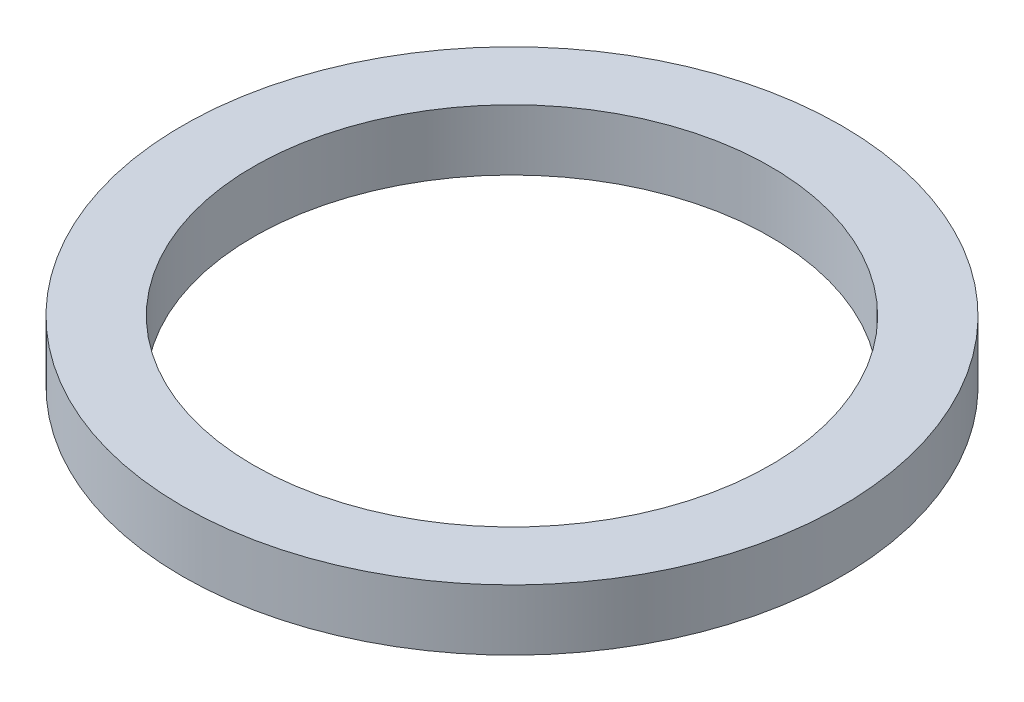
ISO-10303-21;
HEADER;
FILE_DESCRIPTION(('STEP AP214'),'2;1');
FILE_NAME('part.step','',(''),(''),'','','');
FILE_SCHEMA(('AUTOMOTIVE_DESIGN { 1 0 10303 214 1 1 1 1 }'));
ENDSEC;
DATA;
#1=APPLICATION_CONTEXT('core data for automotive mechanical design processes');
#2=APPLICATION_PROTOCOL_DEFINITION('international standard','automotive_design',2000,#1);
#3=PRODUCT_CONTEXT('',#1,'mechanical');
#4=PRODUCT('Part','Part','',(#3));
#5=PRODUCT_RELATED_PRODUCT_CATEGORY('part','',(#4));
#6=PRODUCT_DEFINITION_FORMATION('','',#4);
#7=PRODUCT_DEFINITION_CONTEXT('part definition',#1,'design');
#8=PRODUCT_DEFINITION('design','',#6,#7);
#9=PRODUCT_DEFINITION_SHAPE('','',#8);
#10=(LENGTH_UNIT() NAMED_UNIT(*) SI_UNIT(.MILLI.,.METRE.));
#11=(NAMED_UNIT(*) PLANE_ANGLE_UNIT() SI_UNIT($,.RADIAN.));
#12=(NAMED_UNIT(*) SI_UNIT($,.STERADIAN.) SOLID_ANGLE_UNIT());
#13=UNCERTAINTY_MEASURE_WITH_UNIT(LENGTH_MEASURE(1.E-05),#10,'distance_accuracy_value','');
#14=(GEOMETRIC_REPRESENTATION_CONTEXT(3) GLOBAL_UNCERTAINTY_ASSIGNED_CONTEXT((#13)) GLOBAL_UNIT_ASSIGNED_CONTEXT((#10,
#11,#12)) REPRESENTATION_CONTEXT('',''));
#15=CARTESIAN_POINT('',(0.,0.,0.));
#16=DIRECTION('',(0.,0.,1.));
#17=DIRECTION('',(1.,0.,0.));
#18=AXIS2_PLACEMENT_3D('',#15,#16,#17);
#19=CARTESIAN_POINT('',(0.,6.,0.));
#20=DIRECTION('',(0.,1.,0.));
#21=DIRECTION('',(0.,0.,1.));
#22=AXIS2_PLACEMENT_3D('',#19,#20,#21);
#23=PLANE('',#22);
#24=CARTESIAN_POINT('',(0.,6.,0.));
#25=DIRECTION('',(0.,1.,0.));
#26=DIRECTION('',(0.,0.,1.));
#27=AXIS2_PLACEMENT_3D('',#24,#25,#26);
#28=CIRCLE('',#27,32.5);
#29=CARTESIAN_POINT('',(0.,6.,32.5));
#30=VERTEX_POINT('',#29);
#31=EDGE_CURVE('E10',#30,#30,#28,.T.);
#32=ORIENTED_EDGE('',*,*,#31,.T.);
#33=EDGE_LOOP('',(#32));
#34=FACE_BOUND('',#33,.T.);
#35=CARTESIAN_POINT('',(0.,6.,0.));
#36=DIRECTION('',(0.,1.,0.));
#37=DIRECTION('',(0.,0.,1.));
#38=AXIS2_PLACEMENT_3D('',#35,#36,#37);
#39=CIRCLE('',#38,25.5);
#40=CARTESIAN_POINT('',(0.,6.,25.5));
#41=VERTEX_POINT('',#40);
#42=EDGE_CURVE('E43',#41,#41,#39,.T.);
#43=ORIENTED_EDGE('',*,*,#42,.F.);
#44=EDGE_LOOP('',(#43));
#45=FACE_BOUND('',#44,.T.);
#46=ADVANCED_FACE('F32',(#34,#45),#23,.T.);
#47=CARTESIAN_POINT('',(0.,0.,0.));
#48=DIRECTION('',(0.,1.,0.));
#49=DIRECTION('',(0.,0.,1.));
#50=AXIS2_PLACEMENT_3D('',#47,#48,#49);
#51=PLANE('',#50);
#52=CARTESIAN_POINT('',(0.,0.,0.));
#53=DIRECTION('',(0.,1.,0.));
#54=DIRECTION('',(0.,0.,1.));
#55=AXIS2_PLACEMENT_3D('',#52,#53,#54);
#56=CIRCLE('',#55,32.5);
#57=CARTESIAN_POINT('',(0.,0.,32.5));
#58=VERTEX_POINT('',#57);
#59=EDGE_CURVE('E36',#58,#58,#56,.T.);
#60=ORIENTED_EDGE('',*,*,#59,.F.);
#61=EDGE_LOOP('',(#60));
#62=FACE_BOUND('',#61,.T.);
#63=CARTESIAN_POINT('',(0.,0.,0.));
#64=DIRECTION('',(0.,1.,0.));
#65=DIRECTION('',(0.,0.,1.));
#66=AXIS2_PLACEMENT_3D('',#63,#64,#65);
#67=CIRCLE('',#66,25.5);
#68=CARTESIAN_POINT('',(0.,0.,25.5));
#69=VERTEX_POINT('',#68);
#70=EDGE_CURVE('E45',#69,#69,#67,.T.);
#71=ORIENTED_EDGE('',*,*,#70,.T.);
#72=EDGE_LOOP('',(#71));
#73=FACE_BOUND('',#72,.T.);
#74=ADVANCED_FACE('F55',(#62,#73),#51,.F.);
#75=CARTESIAN_POINT('',(0.,6.,0.));
#76=DIRECTION('',(0.,-1.,0.));
#77=DIRECTION('',(0.,0.,-1.));
#78=AXIS2_PLACEMENT_3D('',#75,#76,#77);
#79=CYLINDRICAL_SURFACE('',#78,32.5);
#80=ORIENTED_EDGE('',*,*,#31,.F.);
#81=EDGE_LOOP('',(#80));
#82=FACE_BOUND('',#81,.T.);
#83=ORIENTED_EDGE('',*,*,#59,.T.);
#84=EDGE_LOOP('',(#83));
#85=FACE_BOUND('',#84,.T.);
#86=ADVANCED_FACE('F34',(#82,#85),#79,.T.);
#87=CARTESIAN_POINT('',(0.,6.,0.));
#88=DIRECTION('',(0.,-1.,0.));
#89=DIRECTION('',(0.,0.,-1.));
#90=AXIS2_PLACEMENT_3D('',#87,#88,#89);
#91=CYLINDRICAL_SURFACE('',#90,25.5);
#92=ORIENTED_EDGE('',*,*,#42,.T.);
#93=EDGE_LOOP('',(#92));
#94=FACE_BOUND('',#93,.T.);
#95=ORIENTED_EDGE('',*,*,#70,.F.);
#96=EDGE_LOOP('',(#95));
#97=FACE_BOUND('',#96,.T.);
#98=ADVANCED_FACE('F51',(#94,#97),#91,.F.);
#99=CLOSED_SHELL('',(#46,#74,#86,#98));
#100=MANIFOLD_SOLID_BREP('B2',#99);
#101=ADVANCED_BREP_SHAPE_REPRESENTATION('',(#18,#100),#14);
#102=SHAPE_DEFINITION_REPRESENTATION(#9,#101);
ENDSEC;
END-ISO-10303-21;
